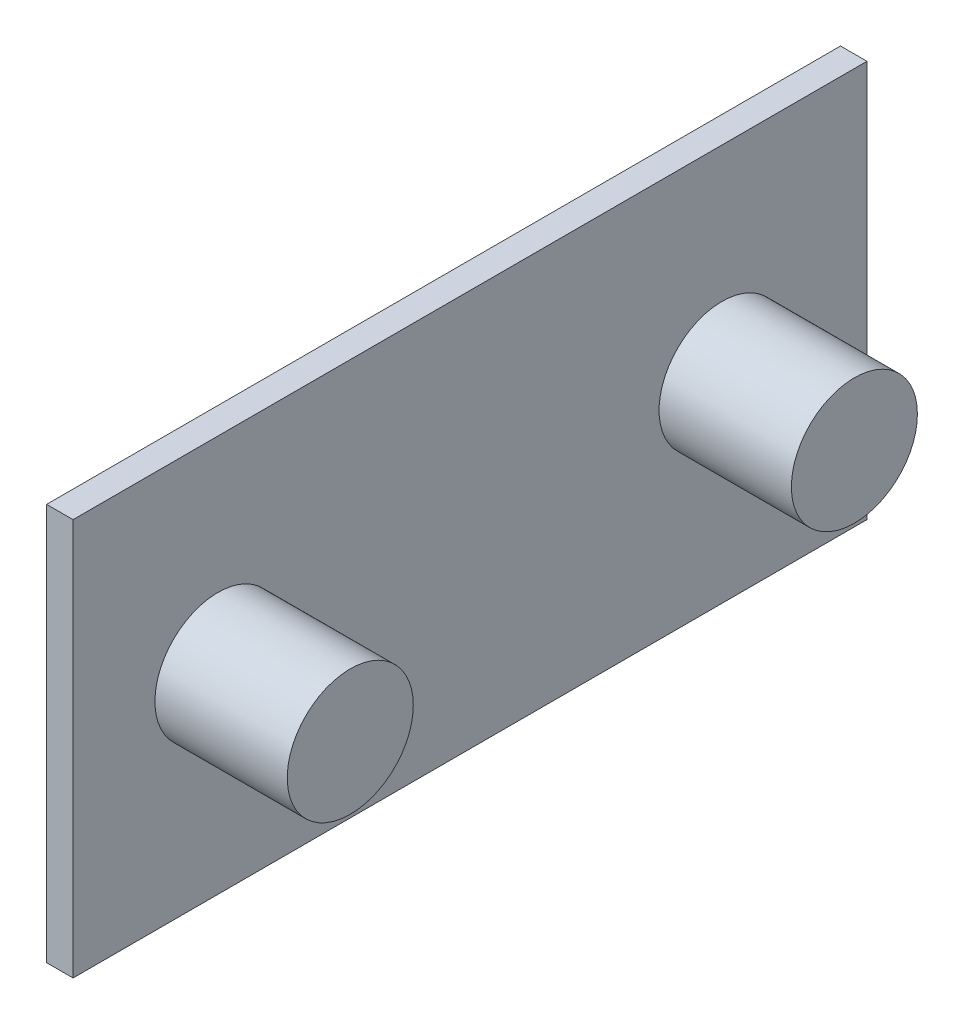
ISO-10303-21;
HEADER;
FILE_DESCRIPTION(('STEP AP214'),'2;1');
FILE_NAME('part.step','',(''),(''),'','','');
FILE_SCHEMA(('AUTOMOTIVE_DESIGN { 1 0 10303 214 1 1 1 1 }'));
ENDSEC;
DATA;
#1=APPLICATION_CONTEXT('core data for automotive mechanical design processes');
#2=APPLICATION_PROTOCOL_DEFINITION('international standard','automotive_design',2000,#1);
#3=PRODUCT_CONTEXT('',#1,'mechanical');
#4=PRODUCT('Part','Part','',(#3));
#5=PRODUCT_RELATED_PRODUCT_CATEGORY('part','',(#4));
#6=PRODUCT_DEFINITION_FORMATION('','',#4);
#7=PRODUCT_DEFINITION_CONTEXT('part definition',#1,'design');
#8=PRODUCT_DEFINITION('design','',#6,#7);
#9=PRODUCT_DEFINITION_SHAPE('','',#8);
#10=(LENGTH_UNIT() NAMED_UNIT(*) SI_UNIT(.MILLI.,.METRE.));
#11=(NAMED_UNIT(*) PLANE_ANGLE_UNIT() SI_UNIT($,.RADIAN.));
#12=(NAMED_UNIT(*) SI_UNIT($,.STERADIAN.) SOLID_ANGLE_UNIT());
#13=UNCERTAINTY_MEASURE_WITH_UNIT(LENGTH_MEASURE(1.E-05),#10,'distance_accuracy_value','');
#14=(GEOMETRIC_REPRESENTATION_CONTEXT(3) GLOBAL_UNCERTAINTY_ASSIGNED_CONTEXT((#13)) GLOBAL_UNIT_ASSIGNED_CONTEXT((#10,
#11,#12)) REPRESENTATION_CONTEXT('',''));
#15=CARTESIAN_POINT('',(0.,0.,0.));
#16=DIRECTION('',(0.,0.,1.));
#17=DIRECTION('',(1.,0.,0.));
#18=AXIS2_PLACEMENT_3D('',#15,#16,#17);
#19=CARTESIAN_POINT('',(2.,15.,0.));
#20=DIRECTION('',(0.,-1.,0.));
#21=DIRECTION('',(0.,0.,-1.));
#22=AXIS2_PLACEMENT_3D('',#19,#20,#21);
#23=PLANE('',#22);
#24=DIRECTION('',(0.,0.,1.));
#25=VECTOR('',#24,1.);
#26=CARTESIAN_POINT('',(0.,15.,0.));
#27=LINE('',#26,#25);
#28=CARTESIAN_POINT('',(0.,15.,-30.));
#29=VERTEX_POINT('',#28);
#30=CARTESIAN_POINT('',(0.,15.,30.));
#31=VERTEX_POINT('',#30);
#32=EDGE_CURVE('E107',#29,#31,#27,.T.);
#33=ORIENTED_EDGE('',*,*,#32,.T.);
#34=DIRECTION('',(-1.,0.,0.));
#35=VECTOR('',#34,1.);
#36=CARTESIAN_POINT('',(2.,15.,30.));
#37=LINE('',#36,#35);
#38=CARTESIAN_POINT('',(2.,15.,30.));
#39=VERTEX_POINT('',#38);
#40=EDGE_CURVE('E11',#39,#31,#37,.T.);
#41=ORIENTED_EDGE('',*,*,#40,.F.);
#42=DIRECTION('',(0.,0.,1.));
#43=VECTOR('',#42,1.);
#44=CARTESIAN_POINT('',(2.,15.,0.));
#45=LINE('',#44,#43);
#46=CARTESIAN_POINT('',(2.,15.,-30.));
#47=VERTEX_POINT('',#46);
#48=EDGE_CURVE('E89',#47,#39,#45,.T.);
#49=ORIENTED_EDGE('',*,*,#48,.F.);
#50=DIRECTION('',(-1.,0.,0.));
#51=VECTOR('',#50,1.);
#52=CARTESIAN_POINT('',(2.,15.,-30.));
#53=LINE('',#52,#51);
#54=EDGE_CURVE('E56',#47,#29,#53,.T.);
#55=ORIENTED_EDGE('',*,*,#54,.T.);
#56=EDGE_LOOP('',(#33,#41,#49,#55));
#57=FACE_BOUND('',#56,.T.);
#58=ADVANCED_FACE('F39',(#57),#23,.F.);
#59=CARTESIAN_POINT('',(2.,0.,30.));
#60=DIRECTION('',(0.,0.,-1.));
#61=DIRECTION('',(-1.,0.,0.));
#62=AXIS2_PLACEMENT_3D('',#59,#60,#61);
#63=PLANE('',#62);
#64=DIRECTION('',(0.,-1.,0.));
#65=VECTOR('',#64,1.);
#66=CARTESIAN_POINT('',(0.,0.,30.));
#67=LINE('',#66,#65);
#68=CARTESIAN_POINT('',(0.,-15.,30.));
#69=VERTEX_POINT('',#68);
#70=EDGE_CURVE('E95',#31,#69,#67,.T.);
#71=ORIENTED_EDGE('',*,*,#70,.T.);
#72=DIRECTION('',(-1.,0.,0.));
#73=VECTOR('',#72,1.);
#74=CARTESIAN_POINT('',(2.,-15.,30.));
#75=LINE('',#74,#73);
#76=CARTESIAN_POINT('',(2.,-15.,30.));
#77=VERTEX_POINT('',#76);
#78=EDGE_CURVE('E48',#77,#69,#75,.T.);
#79=ORIENTED_EDGE('',*,*,#78,.F.);
#80=DIRECTION('',(0.,-1.,0.));
#81=VECTOR('',#80,1.);
#82=CARTESIAN_POINT('',(2.,0.,30.));
#83=LINE('',#82,#81);
#84=EDGE_CURVE('E81',#39,#77,#83,.T.);
#85=ORIENTED_EDGE('',*,*,#84,.F.);
#86=ORIENTED_EDGE('',*,*,#40,.T.);
#87=EDGE_LOOP('',(#71,#79,#85,#86));
#88=FACE_BOUND('',#87,.T.);
#89=ADVANCED_FACE('F94',(#88),#63,.F.);
#90=CARTESIAN_POINT('',(2.,-15.,0.));
#91=DIRECTION('',(0.,-1.,0.));
#92=DIRECTION('',(0.,0.,-1.));
#93=AXIS2_PLACEMENT_3D('',#90,#91,#92);
#94=PLANE('',#93);
#95=DIRECTION('',(0.,0.,1.));
#96=VECTOR('',#95,1.);
#97=CARTESIAN_POINT('',(0.,-15.,0.));
#98=LINE('',#97,#96);
#99=CARTESIAN_POINT('',(0.,-15.,-30.));
#100=VERTEX_POINT('',#99);
#101=EDGE_CURVE('E113',#100,#69,#98,.T.);
#102=ORIENTED_EDGE('',*,*,#101,.F.);
#103=DIRECTION('',(-1.,0.,0.));
#104=VECTOR('',#103,1.);
#105=CARTESIAN_POINT('',(2.,-15.,-30.));
#106=LINE('',#105,#104);
#107=CARTESIAN_POINT('',(2.,-15.,-30.));
#108=VERTEX_POINT('',#107);
#109=EDGE_CURVE('E70',#108,#100,#106,.T.);
#110=ORIENTED_EDGE('',*,*,#109,.F.);
#111=DIRECTION('',(0.,0.,1.));
#112=VECTOR('',#111,1.);
#113=CARTESIAN_POINT('',(2.,-15.,0.));
#114=LINE('',#113,#112);
#115=EDGE_CURVE('E88',#108,#77,#114,.T.);
#116=ORIENTED_EDGE('',*,*,#115,.T.);
#117=ORIENTED_EDGE('',*,*,#78,.T.);
#118=EDGE_LOOP('',(#102,#110,#116,#117));
#119=FACE_BOUND('',#118,.T.);
#120=ADVANCED_FACE('F99',(#119),#94,.T.);
#121=CARTESIAN_POINT('',(2.,0.,-30.));
#122=DIRECTION('',(0.,0.,-1.));
#123=DIRECTION('',(-1.,0.,0.));
#124=AXIS2_PLACEMENT_3D('',#121,#122,#123);
#125=PLANE('',#124);
#126=DIRECTION('',(0.,-1.,0.));
#127=VECTOR('',#126,1.);
#128=CARTESIAN_POINT('',(0.,0.,-30.));
#129=LINE('',#128,#127);
#130=EDGE_CURVE('E116',#29,#100,#129,.T.);
#131=ORIENTED_EDGE('',*,*,#130,.F.);
#132=ORIENTED_EDGE('',*,*,#54,.F.);
#133=DIRECTION('',(0.,-1.,0.));
#134=VECTOR('',#133,1.);
#135=CARTESIAN_POINT('',(2.,0.,-30.));
#136=LINE('',#135,#134);
#137=EDGE_CURVE('E101',#47,#108,#136,.T.);
#138=ORIENTED_EDGE('',*,*,#137,.T.);
#139=ORIENTED_EDGE('',*,*,#109,.T.);
#140=EDGE_LOOP('',(#131,#132,#138,#139));
#141=FACE_BOUND('',#140,.T.);
#142=ADVANCED_FACE('F154',(#141),#125,.T.);
#143=CARTESIAN_POINT('',(2.,0.,0.));
#144=DIRECTION('',(1.,0.,0.));
#145=DIRECTION('',(0.,0.,-1.));
#146=AXIS2_PLACEMENT_3D('',#143,#144,#145);
#147=PLANE('',#146);
#148=CARTESIAN_POINT('',(2.,0.,-19.05));
#149=DIRECTION('',(1.,0.,0.));
#150=DIRECTION('',(0.,0.,-1.));
#151=AXIS2_PLACEMENT_3D('',#148,#149,#150);
#152=CIRCLE('',#151,4.7625);
#153=CARTESIAN_POINT('',(2.,0.,-23.8125));
#154=VERTEX_POINT('',#153);
#155=EDGE_CURVE('E134',#154,#154,#152,.T.);
#156=ORIENTED_EDGE('',*,*,#155,.F.);
#157=EDGE_LOOP('',(#156));
#158=FACE_BOUND('',#157,.T.);
#159=CARTESIAN_POINT('',(2.,0.,19.05));
#160=DIRECTION('',(1.,0.,0.));
#161=DIRECTION('',(0.,0.,-1.));
#162=AXIS2_PLACEMENT_3D('',#159,#160,#161);
#163=CIRCLE('',#162,4.7625);
#164=CARTESIAN_POINT('',(2.,0.,14.2875));
#165=VERTEX_POINT('',#164);
#166=EDGE_CURVE('E126',#165,#165,#163,.T.);
#167=ORIENTED_EDGE('',*,*,#166,.F.);
#168=EDGE_LOOP('',(#167));
#169=FACE_BOUND('',#168,.T.);
#170=ORIENTED_EDGE('',*,*,#48,.T.);
#171=ORIENTED_EDGE('',*,*,#84,.T.);
#172=ORIENTED_EDGE('',*,*,#115,.F.);
#173=ORIENTED_EDGE('',*,*,#137,.F.);
#174=EDGE_LOOP('',(#170,#171,#172,#173));
#175=FACE_BOUND('',#174,.T.);
#176=ADVANCED_FACE('F85',(#158,#169,#175),#147,.T.);
#177=CARTESIAN_POINT('',(0.,0.,0.));
#178=DIRECTION('',(1.,0.,0.));
#179=DIRECTION('',(0.,0.,-1.));
#180=AXIS2_PLACEMENT_3D('',#177,#178,#179);
#181=PLANE('',#180);
#182=ORIENTED_EDGE('',*,*,#32,.F.);
#183=ORIENTED_EDGE('',*,*,#130,.T.);
#184=ORIENTED_EDGE('',*,*,#101,.T.);
#185=ORIENTED_EDGE('',*,*,#70,.F.);
#186=EDGE_LOOP('',(#182,#183,#184,#185));
#187=FACE_BOUND('',#186,.T.);
#188=ADVANCED_FACE('F153',(#187),#181,.F.);
#189=CARTESIAN_POINT('',(12.,0.,19.05));
#190=DIRECTION('',(-1.,0.,0.));
#191=DIRECTION('',(0.,0.,1.));
#192=AXIS2_PLACEMENT_3D('',#189,#190,#191);
#193=CYLINDRICAL_SURFACE('',#192,4.7625);
#194=CARTESIAN_POINT('',(12.,0.,19.05));
#195=DIRECTION('',(1.,0.,0.));
#196=DIRECTION('',(0.,0.,-1.));
#197=AXIS2_PLACEMENT_3D('',#194,#195,#196);
#198=CIRCLE('',#197,4.7625);
#199=CARTESIAN_POINT('',(12.,0.,14.2875));
#200=VERTEX_POINT('',#199);
#201=EDGE_CURVE('E110',#200,#200,#198,.T.);
#202=ORIENTED_EDGE('',*,*,#201,.F.);
#203=EDGE_LOOP('',(#202));
#204=FACE_BOUND('',#203,.T.);
#205=ORIENTED_EDGE('',*,*,#166,.T.);
#206=EDGE_LOOP('',(#205));
#207=FACE_BOUND('',#206,.T.);
#208=ADVANCED_FACE('F158',(#204,#207),#193,.T.);
#209=CARTESIAN_POINT('',(12.,0.,19.05));
#210=DIRECTION('',(1.,0.,0.));
#211=DIRECTION('',(0.,0.,-1.));
#212=AXIS2_PLACEMENT_3D('',#209,#210,#211);
#213=PLANE('',#212);
#214=ORIENTED_EDGE('',*,*,#201,.T.);
#215=EDGE_LOOP('',(#214));
#216=FACE_BOUND('',#215,.T.);
#217=ADVANCED_FACE('F147',(#216),#213,.T.);
#218=CARTESIAN_POINT('',(12.,0.,-19.05));
#219=DIRECTION('',(-1.,0.,0.));
#220=DIRECTION('',(0.,0.,1.));
#221=AXIS2_PLACEMENT_3D('',#218,#219,#220);
#222=CYLINDRICAL_SURFACE('',#221,4.7625);
#223=CARTESIAN_POINT('',(12.,0.,-19.05));
#224=DIRECTION('',(1.,0.,0.));
#225=DIRECTION('',(0.,0.,-1.));
#226=AXIS2_PLACEMENT_3D('',#223,#224,#225);
#227=CIRCLE('',#226,4.7625);
#228=CARTESIAN_POINT('',(12.,0.,-23.8125));
#229=VERTEX_POINT('',#228);
#230=EDGE_CURVE('E130',#229,#229,#227,.T.);
#231=ORIENTED_EDGE('',*,*,#230,.F.);
#232=EDGE_LOOP('',(#231));
#233=FACE_BOUND('',#232,.T.);
#234=ORIENTED_EDGE('',*,*,#155,.T.);
#235=EDGE_LOOP('',(#234));
#236=FACE_BOUND('',#235,.T.);
#237=ADVANCED_FACE('F144',(#233,#236),#222,.T.);
#238=CARTESIAN_POINT('',(12.,0.,-19.05));
#239=DIRECTION('',(1.,0.,0.));
#240=DIRECTION('',(0.,0.,-1.));
#241=AXIS2_PLACEMENT_3D('',#238,#239,#240);
#242=PLANE('',#241);
#243=ORIENTED_EDGE('',*,*,#230,.T.);
#244=EDGE_LOOP('',(#243));
#245=FACE_BOUND('',#244,.T.);
#246=ADVANCED_FACE('F142',(#245),#242,.T.);
#247=CLOSED_SHELL('',(#58,#89,#120,#142,#176,#188,#208,#217,#237,#246));
#248=MANIFOLD_SOLID_BREP('B2',#247);
#249=ADVANCED_BREP_SHAPE_REPRESENTATION('',(#18,#248),#14);
#250=SHAPE_DEFINITION_REPRESENTATION(#9,#249);
ENDSEC;
END-ISO-10303-21;
